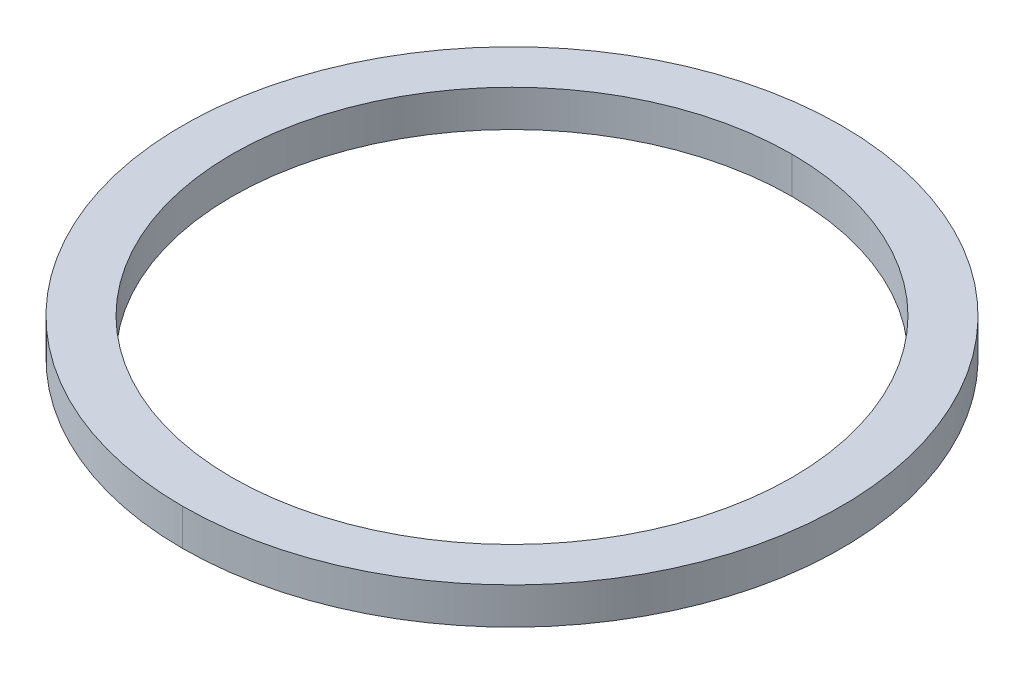
ISO-10303-21;
HEADER;
FILE_DESCRIPTION(('STEP AP214'),'2;1');
FILE_NAME('part.step','',(''),(''),'','','');
FILE_SCHEMA(('AUTOMOTIVE_DESIGN { 1 0 10303 214 1 1 1 1 }'));
ENDSEC;
DATA;
#1=APPLICATION_CONTEXT('core data for automotive mechanical design processes');
#2=APPLICATION_PROTOCOL_DEFINITION('international standard','automotive_design',2000,#1);
#3=PRODUCT_CONTEXT('',#1,'mechanical');
#4=PRODUCT('Part','Part','',(#3));
#5=PRODUCT_RELATED_PRODUCT_CATEGORY('part','',(#4));
#6=PRODUCT_DEFINITION_FORMATION('','',#4);
#7=PRODUCT_DEFINITION_CONTEXT('part definition',#1,'design');
#8=PRODUCT_DEFINITION('design','',#6,#7);
#9=PRODUCT_DEFINITION_SHAPE('','',#8);
#10=(LENGTH_UNIT() NAMED_UNIT(*) SI_UNIT(.MILLI.,.METRE.));
#11=(NAMED_UNIT(*) PLANE_ANGLE_UNIT() SI_UNIT($,.RADIAN.));
#12=(NAMED_UNIT(*) SI_UNIT($,.STERADIAN.) SOLID_ANGLE_UNIT());
#13=UNCERTAINTY_MEASURE_WITH_UNIT(LENGTH_MEASURE(1.E-05),#10,'distance_accuracy_value','');
#14=(GEOMETRIC_REPRESENTATION_CONTEXT(3) GLOBAL_UNCERTAINTY_ASSIGNED_CONTEXT((#13)) GLOBAL_UNIT_ASSIGNED_CONTEXT((#10,
#11,#12)) REPRESENTATION_CONTEXT('',''));
#15=CARTESIAN_POINT('',(0.,0.,0.));
#16=DIRECTION('',(0.,0.,1.));
#17=DIRECTION('',(1.,0.,0.));
#18=AXIS2_PLACEMENT_3D('',#15,#16,#17);
#19=CARTESIAN_POINT('',(0.,1.7,0.));
#20=DIRECTION('',(0.,-1.,0.));
#21=DIRECTION('',(0.,0.,-1.));
#22=AXIS2_PLACEMENT_3D('',#19,#20,#21);
#23=CYLINDRICAL_SURFACE('',#22,13.);
#24=DIRECTION('',(0.,-1.,0.));
#25=VECTOR('',#24,1.);
#26=CARTESIAN_POINT('',(0.,1.7,13.));
#27=LINE('',#26,#25);
#28=CARTESIAN_POINT('',(0.,1.7,13.));
#29=VERTEX_POINT('',#28);
#30=CARTESIAN_POINT('',(0.,0.,13.));
#31=VERTEX_POINT('',#30);
#32=EDGE_CURVE('E80',#29,#31,#27,.T.);
#33=ORIENTED_EDGE('',*,*,#32,.F.);
#34=CARTESIAN_POINT('',(0.,1.7,0.));
#35=DIRECTION('',(0.,1.,0.));
#36=DIRECTION('',(0.,0.,1.));
#37=AXIS2_PLACEMENT_3D('',#34,#35,#36);
#38=CIRCLE('',#37,13.);
#39=CARTESIAN_POINT('',(0.,1.7,-13.));
#40=VERTEX_POINT('',#39);
#41=EDGE_CURVE('E71',#29,#40,#38,.T.);
#42=ORIENTED_EDGE('',*,*,#41,.T.);
#43=DIRECTION('',(0.,-1.,0.));
#44=VECTOR('',#43,1.);
#45=CARTESIAN_POINT('',(0.,1.7,-13.));
#46=LINE('',#45,#44);
#47=CARTESIAN_POINT('',(0.,0.,-13.));
#48=VERTEX_POINT('',#47);
#49=EDGE_CURVE('E72',#40,#48,#46,.T.);
#50=ORIENTED_EDGE('',*,*,#49,.T.);
#51=CARTESIAN_POINT('',(0.,0.,0.));
#52=DIRECTION('',(0.,1.,0.));
#53=DIRECTION('',(0.,0.,1.));
#54=AXIS2_PLACEMENT_3D('',#51,#52,#53);
#55=CIRCLE('',#54,13.);
#56=EDGE_CURVE('E11',#31,#48,#55,.T.);
#57=ORIENTED_EDGE('',*,*,#56,.F.);
#58=EDGE_LOOP('',(#33,#42,#50,#57));
#59=FACE_BOUND('',#58,.T.);
#60=ADVANCED_FACE('F17',(#59),#23,.F.);
#61=CARTESIAN_POINT('',(0.,1.7,0.));
#62=DIRECTION('',(0.,-1.,0.));
#63=DIRECTION('',(0.,0.,-1.));
#64=AXIS2_PLACEMENT_3D('',#61,#62,#63);
#65=CYLINDRICAL_SURFACE('',#64,15.3);
#66=DIRECTION('',(0.,-1.,0.));
#67=VECTOR('',#66,1.);
#68=CARTESIAN_POINT('',(0.,1.7,15.3));
#69=LINE('',#68,#67);
#70=CARTESIAN_POINT('',(0.,1.7,15.3));
#71=VERTEX_POINT('',#70);
#72=CARTESIAN_POINT('',(0.,0.,15.3));
#73=VERTEX_POINT('',#72);
#74=EDGE_CURVE('E104',#71,#73,#69,.T.);
#75=ORIENTED_EDGE('',*,*,#74,.F.);
#76=CARTESIAN_POINT('',(0.,1.7,0.));
#77=DIRECTION('',(0.,1.,0.));
#78=DIRECTION('',(0.,0.,1.));
#79=AXIS2_PLACEMENT_3D('',#76,#77,#78);
#80=CIRCLE('',#79,15.3);
#81=CARTESIAN_POINT('',(0.,1.7,-15.3));
#82=VERTEX_POINT('',#81);
#83=EDGE_CURVE('E85',#82,#71,#80,.T.);
#84=ORIENTED_EDGE('',*,*,#83,.F.);
#85=DIRECTION('',(0.,-1.,0.));
#86=VECTOR('',#85,1.);
#87=CARTESIAN_POINT('',(0.,1.7,-15.3));
#88=LINE('',#87,#86);
#89=CARTESIAN_POINT('',(0.,0.,-15.3));
#90=VERTEX_POINT('',#89);
#91=EDGE_CURVE('E111',#82,#90,#88,.T.);
#92=ORIENTED_EDGE('',*,*,#91,.T.);
#93=CARTESIAN_POINT('',(0.,0.,0.));
#94=DIRECTION('',(0.,1.,0.));
#95=DIRECTION('',(0.,0.,1.));
#96=AXIS2_PLACEMENT_3D('',#93,#94,#95);
#97=CIRCLE('',#96,15.3);
#98=EDGE_CURVE('E27',#90,#73,#97,.T.);
#99=ORIENTED_EDGE('',*,*,#98,.T.);
#100=EDGE_LOOP('',(#75,#84,#92,#99));
#101=FACE_BOUND('',#100,.T.);
#102=ADVANCED_FACE('F19',(#101),#65,.T.);
#103=CARTESIAN_POINT('',(0.,0.,0.));
#104=DIRECTION('',(0.,1.,0.));
#105=DIRECTION('',(1.,0.,0.));
#106=AXIS2_PLACEMENT_3D('',#103,#104,#105);
#107=PLANE('',#106);
#108=CARTESIAN_POINT('',(0.,0.,0.));
#109=DIRECTION('',(0.,1.,0.));
#110=DIRECTION('',(0.,0.,1.));
#111=AXIS2_PLACEMENT_3D('',#108,#109,#110);
#112=CIRCLE('',#111,13.);
#113=EDGE_CURVE('E86',#48,#31,#112,.T.);
#114=ORIENTED_EDGE('',*,*,#113,.T.);
#115=ORIENTED_EDGE('',*,*,#56,.T.);
#116=EDGE_LOOP('',(#114,#115));
#117=FACE_BOUND('',#116,.T.);
#118=ORIENTED_EDGE('',*,*,#98,.F.);
#119=CARTESIAN_POINT('',(0.,0.,0.));
#120=DIRECTION('',(0.,1.,0.));
#121=DIRECTION('',(0.,0.,1.));
#122=AXIS2_PLACEMENT_3D('',#119,#120,#121);
#123=CIRCLE('',#122,15.3);
#124=EDGE_CURVE('E109',#73,#90,#123,.T.);
#125=ORIENTED_EDGE('',*,*,#124,.F.);
#126=EDGE_LOOP('',(#118,#125));
#127=FACE_BOUND('',#126,.T.);
#128=ADVANCED_FACE('F162',(#117,#127),#107,.F.);
#129=CARTESIAN_POINT('',(0.,1.7,0.));
#130=DIRECTION('',(0.,1.,0.));
#131=DIRECTION('',(1.,0.,0.));
#132=AXIS2_PLACEMENT_3D('',#129,#130,#131);
#133=PLANE('',#132);
#134=CARTESIAN_POINT('',(0.,1.7,0.));
#135=DIRECTION('',(0.,1.,0.));
#136=DIRECTION('',(0.,0.,1.));
#137=AXIS2_PLACEMENT_3D('',#134,#135,#136);
#138=CIRCLE('',#137,13.);
#139=EDGE_CURVE('E88',#40,#29,#138,.T.);
#140=ORIENTED_EDGE('',*,*,#139,.F.);
#141=ORIENTED_EDGE('',*,*,#41,.F.);
#142=EDGE_LOOP('',(#140,#141));
#143=FACE_BOUND('',#142,.T.);
#144=ORIENTED_EDGE('',*,*,#83,.T.);
#145=CARTESIAN_POINT('',(0.,1.7,0.));
#146=DIRECTION('',(0.,1.,0.));
#147=DIRECTION('',(0.,0.,1.));
#148=AXIS2_PLACEMENT_3D('',#145,#146,#147);
#149=CIRCLE('',#148,15.3);
#150=EDGE_CURVE('E89',#71,#82,#149,.T.);
#151=ORIENTED_EDGE('',*,*,#150,.T.);
#152=EDGE_LOOP('',(#144,#151));
#153=FACE_BOUND('',#152,.T.);
#154=ADVANCED_FACE('F95',(#143,#153),#133,.T.);
#155=CARTESIAN_POINT('',(0.,1.7,0.));
#156=DIRECTION('',(0.,-1.,0.));
#157=DIRECTION('',(0.,0.,-1.));
#158=AXIS2_PLACEMENT_3D('',#155,#156,#157);
#159=CYLINDRICAL_SURFACE('',#158,15.3);
#160=ORIENTED_EDGE('',*,*,#150,.F.);
#161=ORIENTED_EDGE('',*,*,#74,.T.);
#162=ORIENTED_EDGE('',*,*,#124,.T.);
#163=ORIENTED_EDGE('',*,*,#91,.F.);
#164=EDGE_LOOP('',(#160,#161,#162,#163));
#165=FACE_BOUND('',#164,.T.);
#166=ADVANCED_FACE('F137',(#165),#159,.T.);
#167=CARTESIAN_POINT('',(0.,1.7,0.));
#168=DIRECTION('',(0.,-1.,0.));
#169=DIRECTION('',(0.,0.,-1.));
#170=AXIS2_PLACEMENT_3D('',#167,#168,#169);
#171=CYLINDRICAL_SURFACE('',#170,13.);
#172=ORIENTED_EDGE('',*,*,#139,.T.);
#173=ORIENTED_EDGE('',*,*,#32,.T.);
#174=ORIENTED_EDGE('',*,*,#113,.F.);
#175=ORIENTED_EDGE('',*,*,#49,.F.);
#176=EDGE_LOOP('',(#172,#173,#174,#175));
#177=FACE_BOUND('',#176,.T.);
#178=ADVANCED_FACE('F83',(#177),#171,.F.);
#179=CLOSED_SHELL('',(#60,#102,#128,#154,#166,#178));
#180=MANIFOLD_SOLID_BREP('B1',#179);
#181=ADVANCED_BREP_SHAPE_REPRESENTATION('',(#18,#180),#14);
#182=SHAPE_DEFINITION_REPRESENTATION(#9,#181);
ENDSEC;
END-ISO-10303-21;
